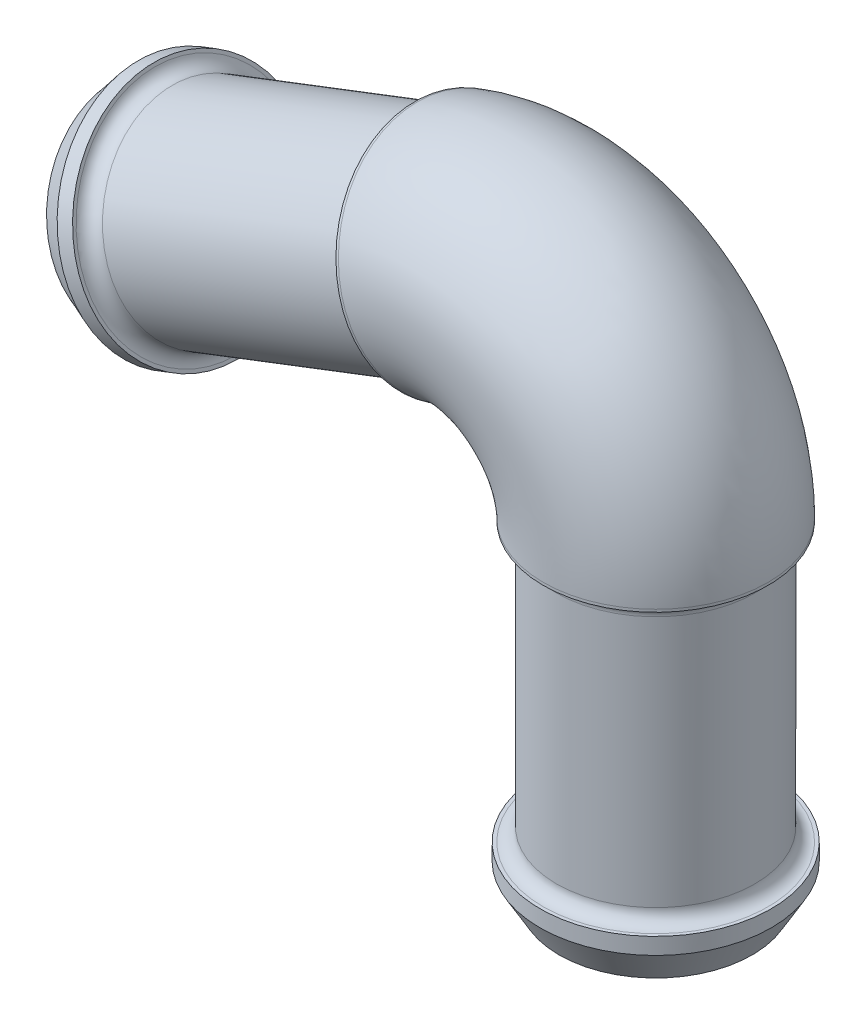
ISO-10303-21;
HEADER;
FILE_DESCRIPTION(('STEP AP214'),'2;1');
FILE_NAME('part.step','',(''),(''),'','','');
FILE_SCHEMA(('AUTOMOTIVE_DESIGN { 1 0 10303 214 1 1 1 1 }'));
ENDSEC;
DATA;
#1=APPLICATION_CONTEXT('core data for automotive mechanical design processes');
#2=APPLICATION_PROTOCOL_DEFINITION('international standard','automotive_design',2000,#1);
#3=PRODUCT_CONTEXT('',#1,'mechanical');
#4=PRODUCT('Part','Part','',(#3));
#5=PRODUCT_RELATED_PRODUCT_CATEGORY('part','',(#4));
#6=PRODUCT_DEFINITION_FORMATION('','',#4);
#7=PRODUCT_DEFINITION_CONTEXT('part definition',#1,'design');
#8=PRODUCT_DEFINITION('design','',#6,#7);
#9=PRODUCT_DEFINITION_SHAPE('','',#8);
#10=(LENGTH_UNIT() NAMED_UNIT(*) SI_UNIT(.MILLI.,.METRE.));
#11=(NAMED_UNIT(*) PLANE_ANGLE_UNIT() SI_UNIT($,.RADIAN.));
#12=(NAMED_UNIT(*) SI_UNIT($,.STERADIAN.) SOLID_ANGLE_UNIT());
#13=UNCERTAINTY_MEASURE_WITH_UNIT(LENGTH_MEASURE(1.E-05),#10,'distance_accuracy_value','');
#14=(GEOMETRIC_REPRESENTATION_CONTEXT(3) GLOBAL_UNCERTAINTY_ASSIGNED_CONTEXT((#13)) GLOBAL_UNIT_ASSIGNED_CONTEXT((#10,
#11,#12)) REPRESENTATION_CONTEXT('',''));
#15=CARTESIAN_POINT('',(0.,0.,0.));
#16=DIRECTION('',(0.,0.,1.));
#17=DIRECTION('',(1.,0.,0.));
#18=AXIS2_PLACEMENT_3D('',#15,#16,#17);
#19=CARTESIAN_POINT('',(0.,0.,0.));
#20=DIRECTION('',(0.,1.,0.));
#21=DIRECTION('',(0.,0.,1.));
#22=AXIS2_PLACEMENT_3D('',#19,#20,#21);
#23=CYLINDRICAL_SURFACE('',#22,9.525);
#24=CARTESIAN_POINT('',(0.,30.226,0.));
#25=DIRECTION('',(0.,1.,0.));
#26=DIRECTION('',(0.,0.,1.));
#27=AXIS2_PLACEMENT_3D('',#24,#25,#26);
#28=CIRCLE('',#27,9.525);
#29=CARTESIAN_POINT('',(0.,30.226,9.525));
#30=VERTEX_POINT('',#29);
#31=EDGE_CURVE('E82',#30,#30,#28,.F.);
#32=ORIENTED_EDGE('',*,*,#31,.T.);
#33=EDGE_LOOP('',(#32));
#34=FACE_BOUND('',#33,.T.);
#35=CARTESIAN_POINT('',(0.,6.0325,0.));
#36=DIRECTION('',(0.,-1.,0.));
#37=DIRECTION('',(0.,0.,-1.));
#38=AXIS2_PLACEMENT_3D('',#35,#36,#37);
#39=CIRCLE('',#38,9.525);
#40=CARTESIAN_POINT('',(0.,6.0325,-9.525));
#41=VERTEX_POINT('',#40);
#42=EDGE_CURVE('E86',#41,#41,#39,.F.);
#43=ORIENTED_EDGE('',*,*,#42,.T.);
#44=EDGE_LOOP('',(#43));
#45=FACE_BOUND('',#44,.T.);
#46=ADVANCED_FACE('F75',(#34,#45),#23,.T.);
#47=CARTESIAN_POINT('',(-19.01204919272,44.8166193941536,0.));
#48=DIRECTION('',(-0.933580426497203,-0.358367949545298,0.));
#49=DIRECTION('',(0.358367949545298,-0.933580426497203,0.));
#50=AXIS2_PLACEMENT_3D('',#47,#48,#49);
#51=CYLINDRICAL_SURFACE('',#50,9.525);
#52=CARTESIAN_POINT('',(-20.4348257627017,44.2704666390466,0.));
#53=DIRECTION('',(-0.933580426497205,-0.358367949545292,0.));
#54=DIRECTION('',(0.358367949545292,-0.933580426497205,0.));
#55=AXIS2_PLACEMENT_3D('',#52,#53,#54);
#56=CIRCLE('',#55,9.525);
#57=CARTESIAN_POINT('',(-17.0213710432828,35.3781130766607,0.));
#58=VERTEX_POINT('',#57);
#59=EDGE_CURVE('E11',#58,#58,#56,.T.);
#60=ORIENTED_EDGE('',*,*,#59,.T.);
#61=EDGE_LOOP('',(#60));
#62=FACE_BOUND('',#61,.T.);
#63=CARTESIAN_POINT('',(-43.0214038111618,35.6002916517224,0.));
#64=DIRECTION('',(-0.933580426497203,-0.358367949545298,0.));
#65=DIRECTION('',(0.358367949545298,-0.933580426497203,0.));
#66=AXIS2_PLACEMENT_3D('',#63,#64,#65);
#67=CIRCLE('',#66,9.525);
#68=CARTESIAN_POINT('',(-39.6079490917428,26.7079380893366,0.));
#69=VERTEX_POINT('',#68);
#70=EDGE_CURVE('E95',#69,#69,#67,.F.);
#71=ORIENTED_EDGE('',*,*,#70,.T.);
#72=EDGE_LOOP('',(#71));
#73=FACE_BOUND('',#72,.T.);
#74=ADVANCED_FACE('F162',(#62,#73),#51,.T.);
#75=CARTESIAN_POINT('',(0.,0.,0.));
#76=DIRECTION('',(0.,1.,0.));
#77=DIRECTION('',(0.,0.,1.));
#78=AXIS2_PLACEMENT_3D('',#75,#76,#77);
#79=PLANE('',#78);
#80=CARTESIAN_POINT('',(0.,0.,0.));
#81=DIRECTION('',(0.,1.,0.));
#82=DIRECTION('',(0.,0.,1.));
#83=AXIS2_PLACEMENT_3D('',#80,#81,#82);
#84=CIRCLE('',#83,9.27941289532299);
#85=CARTESIAN_POINT('',(0.,0.,9.27941289532299));
#86=VERTEX_POINT('',#85);
#87=EDGE_CURVE('E110',#86,#86,#84,.F.);
#88=ORIENTED_EDGE('',*,*,#87,.T.);
#89=EDGE_LOOP('',(#88));
#90=FACE_BOUND('',#89,.T.);
#91=CARTESIAN_POINT('',(0.,0.,0.));
#92=DIRECTION('',(0.,1.,0.));
#93=DIRECTION('',(0.,0.,1.));
#94=AXIS2_PLACEMENT_3D('',#91,#92,#93);
#95=CIRCLE('',#94,7.9375);
#96=CARTESIAN_POINT('',(0.,0.,7.9375));
#97=VERTEX_POINT('',#96);
#98=EDGE_CURVE('E125',#97,#97,#95,.F.);
#99=ORIENTED_EDGE('',*,*,#98,.F.);
#100=EDGE_LOOP('',(#99));
#101=FACE_BOUND('',#100,.T.);
#102=ADVANCED_FACE('F167',(#90,#101),#79,.F.);
#103=CARTESIAN_POINT('',(0.,31.496,0.));
#104=DIRECTION('',(0.,1.,0.));
#105=DIRECTION('',(0.,0.,1.));
#106=AXIS2_PLACEMENT_3D('',#103,#104,#105);
#107=CYLINDRICAL_SURFACE('',#106,10.795);
#108=CARTESIAN_POINT('',(0.,31.75,0.));
#109=DIRECTION('',(0.,1.,0.));
#110=DIRECTION('',(0.,0.,1.));
#111=AXIS2_PLACEMENT_3D('',#108,#109,#110);
#112=CIRCLE('',#111,10.795);
#113=CARTESIAN_POINT('',(10.795,31.75,0.));
#114=VERTEX_POINT('',#113);
#115=EDGE_CURVE('E119',#114,#114,#112,.T.);
#116=ORIENTED_EDGE('',*,*,#115,.F.);
#117=EDGE_LOOP('',(#116));
#118=FACE_BOUND('',#117,.T.);
#119=CARTESIAN_POINT('',(0.,31.496,0.));
#120=DIRECTION('',(0.,1.,0.));
#121=DIRECTION('',(0.,0.,1.));
#122=AXIS2_PLACEMENT_3D('',#119,#120,#121);
#123=CIRCLE('',#122,10.795);
#124=CARTESIAN_POINT('',(0.,31.496,10.795));
#125=VERTEX_POINT('',#124);
#126=EDGE_CURVE('E122',#125,#125,#123,.T.);
#127=ORIENTED_EDGE('',*,*,#126,.T.);
#128=EDGE_LOOP('',(#127));
#129=FACE_BOUND('',#128,.T.);
#130=ADVANCED_FACE('F179',(#118,#129),#107,.T.);
#131=CARTESIAN_POINT('',(-13.9962439478082,31.75,0.));
#132=DIRECTION('',(0.,0.,1.));
#133=DIRECTION('',(1.,0.,0.));
#134=AXIS2_PLACEMENT_3D('',#131,#132,#133);
#135=TOROIDAL_SURFACE('',#134,13.9962439478082,10.795);
#136=CARTESIAN_POINT('',(-19.01204919272,44.8166193941536,0.));
#137=DIRECTION('',(-0.933580426497203,-0.358367949545298,0.));
#138=DIRECTION('',(0.,0.,1.));
#139=AXIS2_PLACEMENT_3D('',#136,#137,#138);
#140=CIRCLE('',#139,10.795);
#141=CARTESIAN_POINT('',(-22.8806312080615,54.8946200981909,0.));
#142=VERTEX_POINT('',#141);
#143=EDGE_CURVE('E116',#142,#142,#140,.T.);
#144=CARTESIAN_POINT('',(-13.9962439478082,31.75,0.));
#145=DIRECTION('',(0.,0.,1.));
#146=DIRECTION('',(1.,0.,0.));
#147=AXIS2_PLACEMENT_3D('',#144,#145,#146);
#148=CIRCLE('',#147,24.7912439478082);
#149=EDGE_CURVE('',#114,#142,#148,.T.);
#150=ORIENTED_EDGE('',*,*,#115,.T.);
#151=ORIENTED_EDGE('',*,*,#143,.F.);
#152=ORIENTED_EDGE('',*,*,#149,.T.);
#153=ORIENTED_EDGE('',*,*,#149,.F.);
#154=EDGE_LOOP('',(#150,#152,#151,#153));
#155=FACE_BOUND('',#154,.T.);
#156=ADVANCED_FACE('F210',(#155),#135,.T.);
#157=CARTESIAN_POINT('',(-19.01204919272,44.8166193941536,0.));
#158=DIRECTION('',(-0.933580426497205,-0.358367949545292,0.));
#159=DIRECTION('',(0.358367949545292,-0.933580426497205,0.));
#160=AXIS2_PLACEMENT_3D('',#157,#158,#159);
#161=CYLINDRICAL_SURFACE('',#160,10.795);
#162=CARTESIAN_POINT('',(-19.2491786210503,44.7255939349691,0.));
#163=DIRECTION('',(-0.933580426497205,-0.358367949545292,0.));
#164=DIRECTION('',(0.,0.,1.));
#165=AXIS2_PLACEMENT_3D('',#162,#163,#164);
#166=CIRCLE('',#165,10.795);
#167=CARTESIAN_POINT('',(-19.2491786210503,44.7255939349691,10.795));
#168=VERTEX_POINT('',#167);
#169=EDGE_CURVE('E113',#168,#168,#166,.T.);
#170=ORIENTED_EDGE('',*,*,#169,.F.);
#171=EDGE_LOOP('',(#170));
#172=FACE_BOUND('',#171,.T.);
#173=ORIENTED_EDGE('',*,*,#143,.T.);
#174=EDGE_LOOP('',(#173));
#175=FACE_BOUND('',#174,.T.);
#176=ADVANCED_FACE('F171',(#172,#175),#161,.T.);
#177=CARTESIAN_POINT('',(-48.6532277340061,33.4384369960904,0.));
#178=DIRECTION('',(-0.933580426497203,-0.358367949545298,0.));
#179=DIRECTION('',(0.,0.,1.));
#180=AXIS2_PLACEMENT_3D('',#177,#178,#179);
#181=PLANE('',#180);
#182=CARTESIAN_POINT('',(-48.6532277340062,33.4384369960905,0.));
#183=DIRECTION('',(-0.933580426497203,-0.358367949545298,0.));
#184=DIRECTION('',(0.358367949545298,-0.933580426497203,0.));
#185=AXIS2_PLACEMENT_3D('',#182,#183,#184);
#186=CIRCLE('',#185,9.27941289532287);
#187=CARTESIAN_POINT('',(-45.3277835617251,24.7753587476313,0.));
#188=VERTEX_POINT('',#187);
#189=EDGE_CURVE('E104',#188,#188,#186,.T.);
#190=ORIENTED_EDGE('',*,*,#189,.T.);
#191=EDGE_LOOP('',(#190));
#192=FACE_BOUND('',#191,.T.);
#193=CARTESIAN_POINT('',(-48.6532277340061,33.4384369960904,0.));
#194=DIRECTION('',(-0.933580426497203,-0.358367949545298,0.));
#195=DIRECTION('',(0.358367949545298,-0.933580426497203,0.));
#196=AXIS2_PLACEMENT_3D('',#193,#194,#195);
#197=CIRCLE('',#196,7.9375);
#198=CARTESIAN_POINT('',(-45.8086821344903,26.0281423607689,0.));
#199=VERTEX_POINT('',#198);
#200=EDGE_CURVE('E129',#199,#199,#197,.F.);
#201=ORIENTED_EDGE('',*,*,#200,.T.);
#202=EDGE_LOOP('',(#201));
#203=FACE_BOUND('',#202,.T.);
#204=ADVANCED_FACE('F174',(#192,#203),#181,.T.);
#205=CARTESIAN_POINT('',(-53.3211298664894,31.646597248365,0.));
#206=DIRECTION('',(0.933580426497203,0.358367949545298,0.));
#207=DIRECTION('',(-0.358367949545298,0.933580426497203,0.));
#208=AXIS2_PLACEMENT_3D('',#205,#206,#207);
#209=CYLINDRICAL_SURFACE('',#208,7.9375);
#210=CARTESIAN_POINT('',(-19.01204919272,44.8166193941536,0.));
#211=DIRECTION('',(0.933580426497203,0.358367949545298,0.));
#212=DIRECTION('',(-0.358367949545298,0.933580426497203,0.));
#213=AXIS2_PLACEMENT_3D('',#210,#211,#212);
#214=CIRCLE('',#213,7.9375);
#215=CARTESIAN_POINT('',(-21.8565947922359,52.2269140294751,0.));
#216=VERTEX_POINT('',#215);
#217=EDGE_CURVE('E132',#216,#216,#214,.T.);
#218=ORIENTED_EDGE('',*,*,#217,.T.);
#219=EDGE_LOOP('',(#218));
#220=FACE_BOUND('',#219,.T.);
#221=ORIENTED_EDGE('',*,*,#200,.F.);
#222=EDGE_LOOP('',(#221));
#223=FACE_BOUND('',#222,.T.);
#224=ADVANCED_FACE('F177',(#220,#223),#209,.F.);
#225=CARTESIAN_POINT('',(-13.9962439478082,31.75,0.));
#226=DIRECTION('',(0.,0.,-1.));
#227=DIRECTION('',(-1.,0.,0.));
#228=AXIS2_PLACEMENT_3D('',#225,#226,#227);
#229=TOROIDAL_SURFACE('',#228,13.9962439478082,7.9375);
#230=CARTESIAN_POINT('',(0.,31.75,0.));
#231=DIRECTION('',(0.,-1.,0.));
#232=DIRECTION('',(1.,0.,0.));
#233=AXIS2_PLACEMENT_3D('',#230,#231,#232);
#234=CIRCLE('',#233,7.9375);
#235=CARTESIAN_POINT('',(7.93749999999999,31.75,0.));
#236=VERTEX_POINT('',#235);
#237=EDGE_CURVE('E128',#236,#236,#234,.T.);
#238=CARTESIAN_POINT('',(-13.9962439478082,31.75,0.));
#239=DIRECTION('',(0.,0.,-1.));
#240=DIRECTION('',(-1.,0.,0.));
#241=AXIS2_PLACEMENT_3D('',#238,#239,#240);
#242=CIRCLE('',#241,21.9337439478082);
#243=EDGE_CURVE('',#216,#236,#242,.T.);
#244=ORIENTED_EDGE('',*,*,#217,.F.);
#245=ORIENTED_EDGE('',*,*,#237,.T.);
#246=ORIENTED_EDGE('',*,*,#243,.T.);
#247=ORIENTED_EDGE('',*,*,#243,.F.);
#248=EDGE_LOOP('',(#244,#246,#245,#247));
#249=FACE_BOUND('',#248,.T.);
#250=ADVANCED_FACE('F221',(#249),#229,.F.);
#251=CARTESIAN_POINT('',(0.,31.75,0.));
#252=DIRECTION('',(0.,-1.,0.));
#253=DIRECTION('',(0.,0.,-1.));
#254=AXIS2_PLACEMENT_3D('',#251,#252,#253);
#255=CYLINDRICAL_SURFACE('',#254,7.9375);
#256=ORIENTED_EDGE('',*,*,#98,.T.);
#257=EDGE_LOOP('',(#256));
#258=FACE_BOUND('',#257,.T.);
#259=ORIENTED_EDGE('',*,*,#237,.F.);
#260=EDGE_LOOP('',(#259));
#261=FACE_BOUND('',#260,.T.);
#262=ADVANCED_FACE('F223',(#258,#261),#255,.F.);
#263=CARTESIAN_POINT('',(-44.2070509528132,35.1451643557999,0.));
#264=DIRECTION('',(-0.933580426497203,-0.358367949545298,0.));
#265=DIRECTION('',(0.358367949545298,-0.933580426497203,0.));
#266=AXIS2_PLACEMENT_3D('',#263,#264,#265);
#267=CYLINDRICAL_SURFACE('',#266,11.1125);
#268=CARTESIAN_POINT('',(-45.6891098798774,34.5762552358968,0.));
#269=DIRECTION('',(-0.933580426497203,-0.358367949545297,0.));
#270=DIRECTION('',(0.358367949545297,-0.933580426497203,0.));
#271=AXIS2_PLACEMENT_3D('',#268,#269,#270);
#272=CIRCLE('',#271,11.1125);
#273=CARTESIAN_POINT('',(-41.7067460405553,24.2018427464466,0.));
#274=VERTEX_POINT('',#273);
#275=EDGE_CURVE('E101',#274,#274,#272,.F.);
#276=ORIENTED_EDGE('',*,*,#275,.T.);
#277=EDGE_LOOP('',(#276));
#278=FACE_BOUND('',#277,.T.);
#279=CARTESIAN_POINT('',(-44.2070509528132,35.1451643557999,0.));
#280=DIRECTION('',(-0.933580426497203,-0.358367949545298,0.));
#281=DIRECTION('',(0.358367949545298,-0.933580426497203,0.));
#282=AXIS2_PLACEMENT_3D('',#279,#280,#281);
#283=CIRCLE('',#282,11.1125);
#284=CARTESIAN_POINT('',(-40.2246871134911,24.7707518663498,0.));
#285=VERTEX_POINT('',#284);
#286=EDGE_CURVE('E133',#285,#285,#283,.T.);
#287=ORIENTED_EDGE('',*,*,#286,.T.);
#288=EDGE_LOOP('',(#287));
#289=FACE_BOUND('',#288,.T.);
#290=ADVANCED_FACE('F227',(#278,#289),#267,.T.);
#291=CARTESIAN_POINT('',(-44.2070509528132,35.1451643557999,0.));
#292=DIRECTION('',(-0.933580426497203,-0.358367949545298,0.));
#293=DIRECTION('',(0.358367949545298,-0.933580426497203,0.));
#294=AXIS2_PLACEMENT_3D('',#291,#292,#293);
#295=PLANE('',#294);
#296=CARTESIAN_POINT('',(-44.2070509528132,35.1451643557999,0.));
#297=DIRECTION('',(-0.933580426497203,-0.358367949545298,0.));
#298=DIRECTION('',(0.358367949545298,-0.933580426497203,0.));
#299=AXIS2_PLACEMENT_3D('',#296,#297,#298);
#300=CIRCLE('',#299,10.795);
#301=CARTESIAN_POINT('',(-40.3384689374717,25.0671636517626,0.));
#302=VERTEX_POINT('',#301);
#303=EDGE_CURVE('E98',#302,#302,#300,.T.);
#304=ORIENTED_EDGE('',*,*,#303,.T.);
#305=EDGE_LOOP('',(#304));
#306=FACE_BOUND('',#305,.T.);
#307=ORIENTED_EDGE('',*,*,#286,.F.);
#308=EDGE_LOOP('',(#307));
#309=FACE_BOUND('',#308,.T.);
#310=ADVANCED_FACE('F158',(#306,#309),#295,.F.);
#311=CARTESIAN_POINT('',(0.,4.7625,0.));
#312=DIRECTION('',(0.,-1.,0.));
#313=DIRECTION('',(0.,0.,-1.));
#314=AXIS2_PLACEMENT_3D('',#311,#312,#313);
#315=CYLINDRICAL_SURFACE('',#314,11.1125);
#316=CARTESIAN_POINT('',(0.,3.17499999999993,0.));
#317=DIRECTION('',(0.,1.,0.));
#318=DIRECTION('',(0.,0.,1.));
#319=AXIS2_PLACEMENT_3D('',#316,#317,#318);
#320=CIRCLE('',#319,11.1125);
#321=CARTESIAN_POINT('',(0.,3.17499999999993,-11.1125));
#322=VERTEX_POINT('',#321);
#323=EDGE_CURVE('E107',#322,#322,#320,.T.);
#324=CARTESIAN_POINT('',(0.,4.7625,0.));
#325=DIRECTION('',(0.,-1.,0.));
#326=DIRECTION('',(0.,0.,-1.));
#327=AXIS2_PLACEMENT_3D('',#324,#325,#326);
#328=CIRCLE('',#327,11.1125);
#329=CARTESIAN_POINT('',(0.,4.7625,-11.1125));
#330=VERTEX_POINT('',#329);
#331=EDGE_CURVE('E140',#330,#330,#328,.T.);
#332=CARTESIAN_POINT('',(0.,3.17499999999993,-11.1125));
#333=CARTESIAN_POINT('',(0.,3.19153645833327,-11.1125));
#334=CARTESIAN_POINT('',(0.,3.2080729166666,-11.1125));
#335=CARTESIAN_POINT('',(0.,3.24114583333327,-11.1125));
#336=CARTESIAN_POINT('',(0.,3.2576822916666,-11.1125));
#337=CARTESIAN_POINT('',(0.,3.29075520833327,-11.1125));
#338=CARTESIAN_POINT('',(0.,3.3072916666666,-11.1125));
#339=CARTESIAN_POINT('',(0.,3.34036458333327,-11.1125));
#340=CARTESIAN_POINT('',(0.,3.35690104166661,-11.1125));
#341=CARTESIAN_POINT('',(0.,3.38997395833327,-11.1125));
#342=CARTESIAN_POINT('',(0.,3.40651041666661,-11.1125));
#343=CARTESIAN_POINT('',(0.,3.43958333333328,-11.1125));
#344=CARTESIAN_POINT('',(0.,3.45611979166661,-11.1125));
#345=CARTESIAN_POINT('',(0.,3.48919270833328,-11.1125));
#346=CARTESIAN_POINT('',(0.,3.50572916666661,-11.1125));
#347=CARTESIAN_POINT('',(0.,3.53880208333328,-11.1125));
#348=CARTESIAN_POINT('',(0.,3.55533854166661,-11.1125));
#349=CARTESIAN_POINT('',(0.,3.58841145833328,-11.1125));
#350=CARTESIAN_POINT('',(0.,3.60494791666662,-11.1125));
#351=CARTESIAN_POINT('',(0.,3.63802083333328,-11.1125));
#352=CARTESIAN_POINT('',(0.,3.65455729166662,-11.1125));
#353=CARTESIAN_POINT('',(0.,3.68763020833329,-11.1125));
#354=CARTESIAN_POINT('',(0.,3.70416666666662,-11.1125));
#355=CARTESIAN_POINT('',(0.,3.73723958333329,-11.1125));
#356=CARTESIAN_POINT('',(0.,3.75377604166662,-11.1125));
#357=CARTESIAN_POINT('',(0.,3.78684895833329,-11.1125));
#358=CARTESIAN_POINT('',(0.,3.80338541666663,-11.1125));
#359=CARTESIAN_POINT('',(0.,3.83645833333329,-11.1125));
#360=CARTESIAN_POINT('',(0.,3.85299479166663,-11.1125));
#361=CARTESIAN_POINT('',(0.,3.8860677083333,-11.1125));
#362=CARTESIAN_POINT('',(0.,3.90260416666663,-11.1125));
#363=CARTESIAN_POINT('',(0.,3.9356770833333,-11.1125));
#364=CARTESIAN_POINT('',(0.,3.95221354166663,-11.1125));
#365=CARTESIAN_POINT('',(0.,3.9852864583333,-11.1125));
#366=CARTESIAN_POINT('',(0.,4.00182291666663,-11.1125));
#367=CARTESIAN_POINT('',(0.,4.0348958333333,-11.1125));
#368=CARTESIAN_POINT('',(0.,4.05143229166664,-11.1125));
#369=CARTESIAN_POINT('',(0.,4.0845052083333,-11.1125));
#370=CARTESIAN_POINT('',(0.,4.10104166666664,-11.1125));
#371=CARTESIAN_POINT('',(0.,4.13411458333331,-11.1125));
#372=CARTESIAN_POINT('',(0.,4.15065104166664,-11.1125));
#373=CARTESIAN_POINT('',(0.,4.18372395833331,-11.1125));
#374=CARTESIAN_POINT('',(0.,4.20026041666664,-11.1125));
#375=CARTESIAN_POINT('',(0.,4.23333333333331,-11.1125));
#376=CARTESIAN_POINT('',(0.,4.24986979166665,-11.1125));
#377=CARTESIAN_POINT('',(0.,4.28294270833331,-11.1125));
#378=CARTESIAN_POINT('',(0.,4.29947916666665,-11.1125));
#379=CARTESIAN_POINT('',(0.,4.33255208333332,-11.1125));
#380=CARTESIAN_POINT('',(0.,4.34908854166665,-11.1125));
#381=CARTESIAN_POINT('',(0.,4.38216145833332,-11.1125));
#382=CARTESIAN_POINT('',(0.,4.39869791666665,-11.1125));
#383=CARTESIAN_POINT('',(0.,4.43177083333332,-11.1125));
#384=CARTESIAN_POINT('',(0.,4.44830729166665,-11.1125));
#385=CARTESIAN_POINT('',(0.,4.48138020833332,-11.1125));
#386=CARTESIAN_POINT('',(0.,4.49791666666666,-11.1125));
#387=CARTESIAN_POINT('',(0.,4.53098958333332,-11.1125));
#388=CARTESIAN_POINT('',(0.,4.54752604166666,-11.1125));
#389=CARTESIAN_POINT('',(0.,4.58059895833333,-11.1125));
#390=CARTESIAN_POINT('',(0.,4.59713541666666,-11.1125));
#391=CARTESIAN_POINT('',(0.,4.63020833333333,-11.1125));
#392=CARTESIAN_POINT('',(0.,4.64674479166666,-11.1125));
#393=CARTESIAN_POINT('',(0.,4.67981770833333,-11.1125));
#394=CARTESIAN_POINT('',(0.,4.69635416666666,-11.1125));
#395=CARTESIAN_POINT('',(0.,4.72942708333333,-11.1125));
#396=CARTESIAN_POINT('',(0.,4.74596354166667,-11.1125));
#397=CARTESIAN_POINT('',(0.,4.7625,-11.1125));
#398=B_SPLINE_CURVE_WITH_KNOTS('',3,(#332,#333,#334,#335,#336,#337,#338,#339,#340,#341,#342,
#343,#344,#345,#346,#347,#348,#349,#350,#351,#352,#353,#354,#355,#356,#357,#358,#359,#360,#361,
#362,#363,#364,#365,#366,#367,#368,#369,#370,#371,#372,#373,#374,#375,#376,#377,#378,#379,#380,
#381,#382,#383,#384,#385,#386,#387,#388,#389,#390,#391,#392,#393,#394,#395,#396,#397),
.UNSPECIFIED.,.F.,.F.,(4,2,2,2,2,2,2,2,2,2,2,2,2,2,2,2,2,2,2,2,2,2,2,2,2,2,2,2,2,2,2,2,4),(0.,
0.0496093750000019,0.0992187500000038,0.148828125000006,0.198437500000009,0.248046875000011,
0.297656250000013,0.347265625000015,0.396875000000017,0.446484375000019,0.496093750000022,
0.545703125000024,0.595312500000026,0.644921875000028,0.69453125000003,0.744140625000033,
0.793750000000035,0.843359375000036,0.892968750000039,0.942578125000041,0.992187500000043,
1.04179687500005,1.09140625000005,1.14101562500005,1.19062500000005,1.24023437500005,
1.28984375000006,1.33945312500006,1.38906250000006,1.43867187500006,1.48828125000007,
1.53789062500007,1.58750000000007),.UNSPECIFIED.);
#399=EDGE_CURVE('BSEAM144',#322,#330,#398,.T.);
#400=ORIENTED_EDGE('',*,*,#323,.T.);
#401=ORIENTED_EDGE('',*,*,#331,.T.);
#402=ORIENTED_EDGE('',*,*,#399,.T.);
#403=ORIENTED_EDGE('',*,*,#399,.F.);
#404=EDGE_LOOP('',(#400,#402,#401,#403));
#405=FACE_BOUND('',#404,.T.);
#406=ADVANCED_FACE('F144',(#405),#315,.T.);
#407=CARTESIAN_POINT('',(0.,4.7625,0.));
#408=DIRECTION('',(0.,-1.,0.));
#409=DIRECTION('',(0.,0.,-1.));
#410=AXIS2_PLACEMENT_3D('',#407,#408,#409);
#411=PLANE('',#410);
#412=CARTESIAN_POINT('',(0.,4.7625,0.));
#413=DIRECTION('',(0.,-1.,0.));
#414=DIRECTION('',(0.,0.,-1.));
#415=AXIS2_PLACEMENT_3D('',#412,#413,#414);
#416=CIRCLE('',#415,10.795);
#417=CARTESIAN_POINT('',(0.,4.7625,-10.795));
#418=VERTEX_POINT('',#417);
#419=EDGE_CURVE('E90',#418,#418,#416,.T.);
#420=ORIENTED_EDGE('',*,*,#419,.T.);
#421=EDGE_LOOP('',(#420));
#422=FACE_BOUND('',#421,.T.);
#423=ORIENTED_EDGE('',*,*,#331,.F.);
#424=EDGE_LOOP('',(#423));
#425=FACE_BOUND('',#424,.T.);
#426=ADVANCED_FACE('F146',(#422,#425),#411,.F.);
#427=CARTESIAN_POINT('',(0.,0.,0.));
#428=DIRECTION('',(0.,1.,0.));
#429=DIRECTION('',(0.,0.,1.));
#430=AXIS2_PLACEMENT_3D('',#427,#428,#429);
#431=CONICAL_SURFACE('',#430,9.27941289532299,0.523598775598296);
#432=ORIENTED_EDGE('',*,*,#323,.F.);
#433=EDGE_LOOP('',(#432));
#434=FACE_BOUND('',#433,.T.);
#435=ORIENTED_EDGE('',*,*,#87,.F.);
#436=EDGE_LOOP('',(#435));
#437=FACE_BOUND('',#436,.T.);
#438=ADVANCED_FACE('F148',(#434,#437),#431,.T.);
#439=CARTESIAN_POINT('',(-48.6532277340062,33.4384369960905,0.));
#440=DIRECTION('',(0.933580426497203,0.358367949545297,0.));
#441=DIRECTION('',(-0.358367949545297,0.933580426497203,0.));
#442=AXIS2_PLACEMENT_3D('',#439,#440,#441);
#443=CONICAL_SURFACE('',#442,9.27941289532287,0.523598775598297);
#444=ORIENTED_EDGE('',*,*,#275,.F.);
#445=EDGE_LOOP('',(#444));
#446=FACE_BOUND('',#445,.T.);
#447=ORIENTED_EDGE('',*,*,#189,.F.);
#448=EDGE_LOOP('',(#447));
#449=FACE_BOUND('',#448,.T.);
#450=ADVANCED_FACE('F155',(#446,#449),#443,.T.);
#451=CARTESIAN_POINT('',(-43.0214038111618,35.6002916517224,0.));
#452=DIRECTION('',(-0.933580426497203,-0.358367949545298,0.));
#453=DIRECTION('',(0.358367949545298,-0.933580426497203,0.));
#454=AXIS2_PLACEMENT_3D('',#451,#452,#453);
#455=TOROIDAL_SURFACE('',#454,10.795,1.27);
#456=ORIENTED_EDGE('',*,*,#70,.F.);
#457=EDGE_LOOP('',(#456));
#458=FACE_BOUND('',#457,.T.);
#459=ORIENTED_EDGE('',*,*,#303,.F.);
#460=EDGE_LOOP('',(#459));
#461=FACE_BOUND('',#460,.T.);
#462=ADVANCED_FACE('F191',(#458,#461),#455,.F.);
#463=CARTESIAN_POINT('',(0.,6.0325,0.));
#464=DIRECTION('',(0.,-1.,0.));
#465=DIRECTION('',(0.,0.,-1.));
#466=AXIS2_PLACEMENT_3D('',#463,#464,#465);
#467=TOROIDAL_SURFACE('',#466,10.795,1.27);
#468=ORIENTED_EDGE('',*,*,#42,.F.);
#469=EDGE_LOOP('',(#468));
#470=FACE_BOUND('',#469,.T.);
#471=ORIENTED_EDGE('',*,*,#419,.F.);
#472=EDGE_LOOP('',(#471));
#473=FACE_BOUND('',#472,.T.);
#474=ADVANCED_FACE('F195',(#470,#473),#467,.F.);
#475=CARTESIAN_POINT('',(0.,30.226,0.));
#476=DIRECTION('',(0.,1.,0.));
#477=DIRECTION('',(0.,0.,1.));
#478=AXIS2_PLACEMENT_3D('',#475,#476,#477);
#479=TOROIDAL_SURFACE('',#478,10.795,1.27);
#480=ORIENTED_EDGE('',*,*,#126,.F.);
#481=EDGE_LOOP('',(#480));
#482=FACE_BOUND('',#481,.T.);
#483=ORIENTED_EDGE('',*,*,#31,.F.);
#484=EDGE_LOOP('',(#483));
#485=FACE_BOUND('',#484,.T.);
#486=ADVANCED_FACE('F198',(#482,#485),#479,.F.);
#487=CARTESIAN_POINT('',(-20.4348257627017,44.2704666390466,0.));
#488=DIRECTION('',(-0.933580426497205,-0.358367949545292,0.));
#489=DIRECTION('',(0.358367949545292,-0.933580426497205,0.));
#490=AXIS2_PLACEMENT_3D('',#487,#488,#489);
#491=TOROIDAL_SURFACE('',#490,10.795,1.27);
#492=ORIENTED_EDGE('',*,*,#59,.F.);
#493=EDGE_LOOP('',(#492));
#494=FACE_BOUND('',#493,.T.);
#495=ORIENTED_EDGE('',*,*,#169,.T.);
#496=EDGE_LOOP('',(#495));
#497=FACE_BOUND('',#496,.T.);
#498=ADVANCED_FACE('F77',(#494,#497),#491,.F.);
#499=CLOSED_SHELL('',(#46,#74,#102,#130,#156,#176,#204,#224,#250,#262,#290,#310,#406,#426,#438,
#450,#462,#474,#486,#498));
#500=MANIFOLD_SOLID_BREP('B2',#499);
#501=ADVANCED_BREP_SHAPE_REPRESENTATION('',(#18,#500),#14);
#502=SHAPE_DEFINITION_REPRESENTATION(#9,#501);
ENDSEC;
END-ISO-10303-21;
